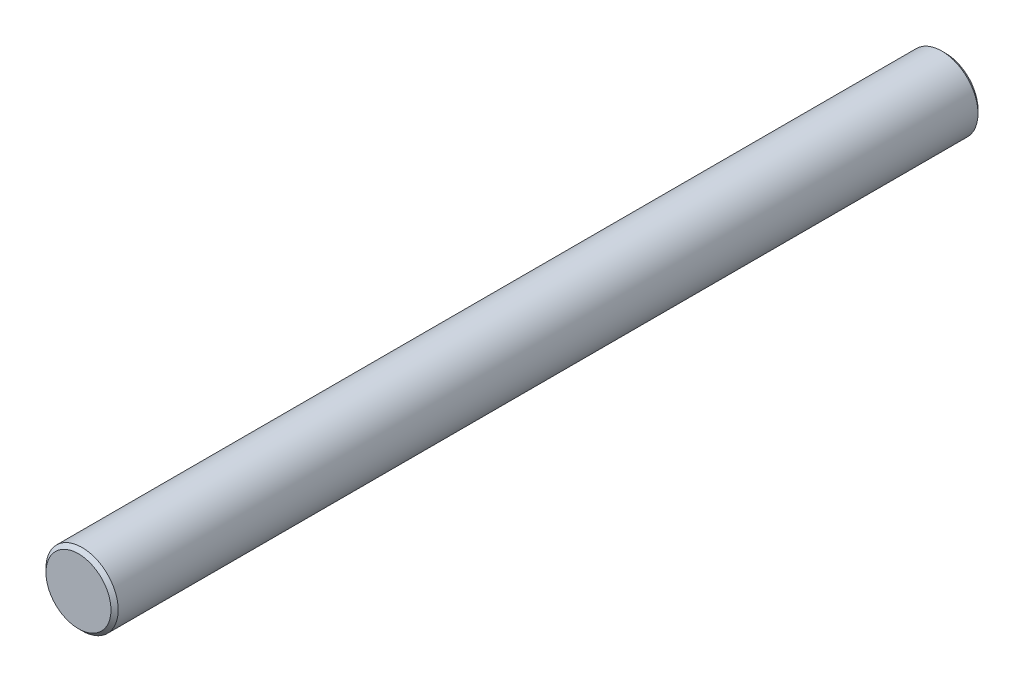
ISO-10303-21;
HEADER;
FILE_DESCRIPTION(('STEP AP214'),'2;1');
FILE_NAME('part.step','',(''),(''),'','','');
FILE_SCHEMA(('AUTOMOTIVE_DESIGN { 1 0 10303 214 1 1 1 1 }'));
ENDSEC;
DATA;
#1=APPLICATION_CONTEXT('core data for automotive mechanical design processes');
#2=APPLICATION_PROTOCOL_DEFINITION('international standard','automotive_design',2000,#1);
#3=PRODUCT_CONTEXT('',#1,'mechanical');
#4=PRODUCT('Part','Part','',(#3));
#5=PRODUCT_RELATED_PRODUCT_CATEGORY('part','',(#4));
#6=PRODUCT_DEFINITION_FORMATION('','',#4);
#7=PRODUCT_DEFINITION_CONTEXT('part definition',#1,'design');
#8=PRODUCT_DEFINITION('design','',#6,#7);
#9=PRODUCT_DEFINITION_SHAPE('','',#8);
#10=(LENGTH_UNIT() NAMED_UNIT(*) SI_UNIT(.MILLI.,.METRE.));
#11=(NAMED_UNIT(*) PLANE_ANGLE_UNIT() SI_UNIT($,.RADIAN.));
#12=(NAMED_UNIT(*) SI_UNIT($,.STERADIAN.) SOLID_ANGLE_UNIT());
#13=UNCERTAINTY_MEASURE_WITH_UNIT(LENGTH_MEASURE(1.E-05),#10,'distance_accuracy_value','');
#14=(GEOMETRIC_REPRESENTATION_CONTEXT(3) GLOBAL_UNCERTAINTY_ASSIGNED_CONTEXT((#13)) GLOBAL_UNIT_ASSIGNED_CONTEXT((#10,
#11,#12)) REPRESENTATION_CONTEXT('',''));
#15=CARTESIAN_POINT('',(0.,0.,0.));
#16=DIRECTION('',(0.,0.,1.));
#17=DIRECTION('',(1.,0.,0.));
#18=AXIS2_PLACEMENT_3D('',#15,#16,#17);
#19=CARTESIAN_POINT('',(0.,0.,60.));
#20=DIRECTION('',(0.,0.,-1.));
#21=DIRECTION('',(-1.,0.,0.));
#22=AXIS2_PLACEMENT_3D('',#19,#20,#21);
#23=CYLINDRICAL_SURFACE('',#22,2.5);
#24=CARTESIAN_POINT('',(0.,0.,0.249999999999993));
#25=DIRECTION('',(0.,0.,1.));
#26=DIRECTION('',(1.,0.,0.));
#27=AXIS2_PLACEMENT_3D('',#24,#25,#26);
#28=CIRCLE('',#27,2.5);
#29=CARTESIAN_POINT('',(2.5,0.,0.249999999999993));
#30=VERTEX_POINT('',#29);
#31=EDGE_CURVE('E53',#30,#30,#28,.T.);
#32=ORIENTED_EDGE('',*,*,#31,.T.);
#33=EDGE_LOOP('',(#32));
#34=FACE_BOUND('',#33,.T.);
#35=CARTESIAN_POINT('',(0.,0.,59.75));
#36=DIRECTION('',(0.,0.,1.));
#37=DIRECTION('',(1.,0.,0.));
#38=AXIS2_PLACEMENT_3D('',#35,#36,#37);
#39=CIRCLE('',#38,2.5);
#40=CARTESIAN_POINT('',(2.5,0.,59.75));
#41=VERTEX_POINT('',#40);
#42=EDGE_CURVE('E58',#41,#41,#39,.F.);
#43=ORIENTED_EDGE('',*,*,#42,.T.);
#44=EDGE_LOOP('',(#43));
#45=FACE_BOUND('',#44,.T.);
#46=ADVANCED_FACE('F39',(#34,#45),#23,.T.);
#47=CARTESIAN_POINT('',(0.,0.,60.));
#48=DIRECTION('',(0.,0.,1.));
#49=DIRECTION('',(1.,0.,0.));
#50=AXIS2_PLACEMENT_3D('',#47,#48,#49);
#51=PLANE('',#50);
#52=CARTESIAN_POINT('',(0.,0.,60.));
#53=DIRECTION('',(0.,0.,1.));
#54=DIRECTION('',(1.,0.,0.));
#55=AXIS2_PLACEMENT_3D('',#52,#53,#54);
#56=CIRCLE('',#55,2.25);
#57=CARTESIAN_POINT('',(2.25,0.,60.));
#58=VERTEX_POINT('',#57);
#59=EDGE_CURVE('E10',#58,#58,#56,.T.);
#60=ORIENTED_EDGE('',*,*,#59,.T.);
#61=EDGE_LOOP('',(#60));
#62=FACE_BOUND('',#61,.T.);
#63=ADVANCED_FACE('F75',(#62),#51,.T.);
#64=CARTESIAN_POINT('',(0.,0.,0.));
#65=DIRECTION('',(0.,0.,1.));
#66=DIRECTION('',(1.,0.,0.));
#67=AXIS2_PLACEMENT_3D('',#64,#65,#66);
#68=PLANE('',#67);
#69=CARTESIAN_POINT('',(0.,0.,0.));
#70=DIRECTION('',(0.,0.,1.));
#71=DIRECTION('',(1.,0.,0.));
#72=AXIS2_PLACEMENT_3D('',#69,#70,#71);
#73=CIRCLE('',#72,2.25);
#74=CARTESIAN_POINT('',(2.25,0.,0.));
#75=VERTEX_POINT('',#74);
#76=EDGE_CURVE('E48',#75,#75,#73,.F.);
#77=ORIENTED_EDGE('',*,*,#76,.T.);
#78=EDGE_LOOP('',(#77));
#79=FACE_BOUND('',#78,.T.);
#80=ADVANCED_FACE('F72',(#79),#68,.F.);
#81=CARTESIAN_POINT('',(0.,0.,0.249999999999993));
#82=DIRECTION('',(0.,0.,1.));
#83=DIRECTION('',(1.,0.,0.));
#84=AXIS2_PLACEMENT_3D('',#81,#82,#83);
#85=CONICAL_SURFACE('',#84,2.5,0.785398163397457);
#86=ORIENTED_EDGE('',*,*,#76,.F.);
#87=EDGE_LOOP('',(#86));
#88=FACE_BOUND('',#87,.T.);
#89=ORIENTED_EDGE('',*,*,#31,.F.);
#90=EDGE_LOOP('',(#89));
#91=FACE_BOUND('',#90,.T.);
#92=ADVANCED_FACE('F68',(#88,#91),#85,.T.);
#93=CARTESIAN_POINT('',(0.,0.,60.));
#94=DIRECTION('',(0.,0.,-1.));
#95=DIRECTION('',(-1.,0.,0.));
#96=AXIS2_PLACEMENT_3D('',#93,#94,#95);
#97=CONICAL_SURFACE('',#96,2.25,0.785398163397443);
#98=ORIENTED_EDGE('',*,*,#42,.F.);
#99=EDGE_LOOP('',(#98));
#100=FACE_BOUND('',#99,.T.);
#101=ORIENTED_EDGE('',*,*,#59,.F.);
#102=EDGE_LOOP('',(#101));
#103=FACE_BOUND('',#102,.T.);
#104=ADVANCED_FACE('F42',(#100,#103),#97,.T.);
#105=CLOSED_SHELL('',(#46,#63,#80,#92,#104));
#106=MANIFOLD_SOLID_BREP('B2',#105);
#107=ADVANCED_BREP_SHAPE_REPRESENTATION('',(#18,#106),#14);
#108=SHAPE_DEFINITION_REPRESENTATION(#9,#107);
ENDSEC;
END-ISO-10303-21;
